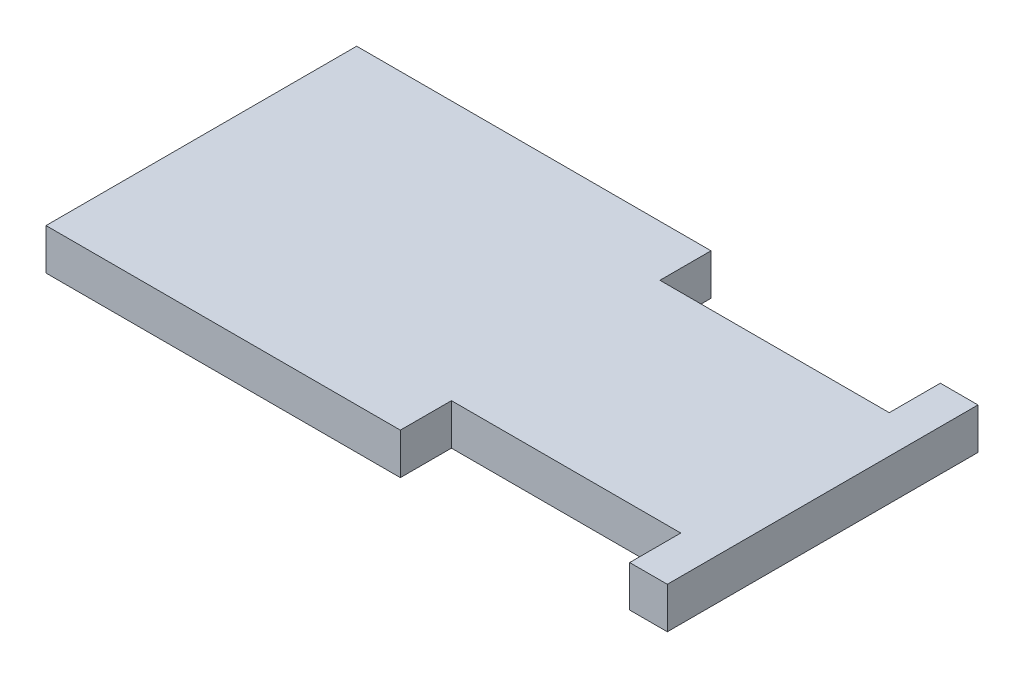
ISO-10303-21;
HEADER;
FILE_DESCRIPTION(('STEP AP214'),'2;1');
FILE_NAME('part.step','',(''),(''),'','','');
FILE_SCHEMA(('AUTOMOTIVE_DESIGN { 1 0 10303 214 1 1 1 1 }'));
ENDSEC;
DATA;
#1=APPLICATION_CONTEXT('core data for automotive mechanical design processes');
#2=APPLICATION_PROTOCOL_DEFINITION('international standard','automotive_design',2000,#1);
#3=PRODUCT_CONTEXT('',#1,'mechanical');
#4=PRODUCT('Part','Part','',(#3));
#5=PRODUCT_RELATED_PRODUCT_CATEGORY('part','',(#4));
#6=PRODUCT_DEFINITION_FORMATION('','',#4);
#7=PRODUCT_DEFINITION_CONTEXT('part definition',#1,'design');
#8=PRODUCT_DEFINITION('design','',#6,#7);
#9=PRODUCT_DEFINITION_SHAPE('','',#8);
#10=(LENGTH_UNIT() NAMED_UNIT(*) SI_UNIT(.MILLI.,.METRE.));
#11=(NAMED_UNIT(*) PLANE_ANGLE_UNIT() SI_UNIT($,.RADIAN.));
#12=(NAMED_UNIT(*) SI_UNIT($,.STERADIAN.) SOLID_ANGLE_UNIT());
#13=UNCERTAINTY_MEASURE_WITH_UNIT(LENGTH_MEASURE(1.E-05),#10,'distance_accuracy_value','');
#14=(GEOMETRIC_REPRESENTATION_CONTEXT(3) GLOBAL_UNCERTAINTY_ASSIGNED_CONTEXT((#13)) GLOBAL_UNIT_ASSIGNED_CONTEXT((#10,
#11,#12)) REPRESENTATION_CONTEXT('',''));
#15=CARTESIAN_POINT('',(0.,0.,0.));
#16=DIRECTION('',(0.,0.,1.));
#17=DIRECTION('',(1.,0.,0.));
#18=AXIS2_PLACEMENT_3D('',#15,#16,#17);
#19=CARTESIAN_POINT('',(-101.6,13.462,-50.8));
#20=DIRECTION('',(0.,0.,1.));
#21=DIRECTION('',(1.,0.,0.));
#22=AXIS2_PLACEMENT_3D('',#19,#20,#21);
#23=PLANE('',#22);
#24=DIRECTION('',(0.,1.,0.));
#25=VECTOR('',#24,1.);
#26=CARTESIAN_POINT('',(14.2854945899929,13.462,-50.8));
#27=LINE('',#26,#25);
#28=CARTESIAN_POINT('',(14.2854945899929,0.,-50.8));
#29=VERTEX_POINT('',#28);
#30=CARTESIAN_POINT('',(14.2854945899929,13.462,-50.8));
#31=VERTEX_POINT('',#30);
#32=EDGE_CURVE('E151',#29,#31,#27,.T.);
#33=ORIENTED_EDGE('',*,*,#32,.F.);
#34=DIRECTION('',(-1.,0.,0.));
#35=VECTOR('',#34,1.);
#36=CARTESIAN_POINT('',(-101.6,0.,-50.8));
#37=LINE('',#36,#35);
#38=CARTESIAN_POINT('',(-101.6,0.,-50.8));
#39=VERTEX_POINT('',#38);
#40=EDGE_CURVE('E211',#29,#39,#37,.T.);
#41=ORIENTED_EDGE('',*,*,#40,.T.);
#42=DIRECTION('',(0.,-1.,0.));
#43=VECTOR('',#42,1.);
#44=CARTESIAN_POINT('',(-101.6,13.462,-50.8));
#45=LINE('',#44,#43);
#46=CARTESIAN_POINT('',(-101.6,13.462,-50.8));
#47=VERTEX_POINT('',#46);
#48=EDGE_CURVE('E230',#47,#39,#45,.T.);
#49=ORIENTED_EDGE('',*,*,#48,.F.);
#50=DIRECTION('',(-1.,0.,0.));
#51=VECTOR('',#50,1.);
#52=CARTESIAN_POINT('',(-101.6,13.462,-50.8));
#53=LINE('',#52,#51);
#54=EDGE_CURVE('E195',#31,#47,#53,.T.);
#55=ORIENTED_EDGE('',*,*,#54,.F.);
#56=EDGE_LOOP('',(#33,#41,#49,#55));
#57=FACE_BOUND('',#56,.T.);
#58=ADVANCED_FACE('F47',(#57),#23,.F.);
#59=DIRECTION('',(0.,-1.,0.));
#60=VECTOR('',#59,1.);
#61=CARTESIAN_POINT('',(89.2854945899928,13.462,-50.8));
#62=LINE('',#61,#60);
#63=CARTESIAN_POINT('',(89.2854945899928,13.462,-50.8));
#64=VERTEX_POINT('',#63);
#65=CARTESIAN_POINT('',(89.2854945899928,0.,-50.8));
#66=VERTEX_POINT('',#65);
#67=EDGE_CURVE('E73',#64,#66,#62,.T.);
#68=ORIENTED_EDGE('',*,*,#67,.F.);
#69=CARTESIAN_POINT('',(101.6,13.462,-50.8));
#70=VERTEX_POINT('',#69);
#71=EDGE_CURVE('E163',#70,#64,#53,.T.);
#72=ORIENTED_EDGE('',*,*,#71,.F.);
#73=DIRECTION('',(0.,-1.,0.));
#74=VECTOR('',#73,1.);
#75=CARTESIAN_POINT('',(101.6,13.462,-50.8));
#76=LINE('',#75,#74);
#77=CARTESIAN_POINT('',(101.6,0.,-50.8));
#78=VERTEX_POINT('',#77);
#79=EDGE_CURVE('E234',#70,#78,#76,.T.);
#80=ORIENTED_EDGE('',*,*,#79,.T.);
#81=EDGE_CURVE('E212',#78,#66,#37,.T.);
#82=ORIENTED_EDGE('',*,*,#81,.T.);
#83=EDGE_LOOP('',(#68,#72,#80,#82));
#84=FACE_BOUND('',#83,.T.);
#85=ADVANCED_FACE('F290',(#84),#23,.F.);
#86=CARTESIAN_POINT('',(-101.6,13.462,50.8));
#87=DIRECTION('',(0.,0.,-1.));
#88=DIRECTION('',(-1.,0.,0.));
#89=AXIS2_PLACEMENT_3D('',#86,#87,#88);
#90=PLANE('',#89);
#91=DIRECTION('',(0.,-1.,0.));
#92=VECTOR('',#91,1.);
#93=CARTESIAN_POINT('',(14.2854945899929,13.462,50.8));
#94=LINE('',#93,#92);
#95=CARTESIAN_POINT('',(14.2854945899929,13.462,50.8));
#96=VERTEX_POINT('',#95);
#97=CARTESIAN_POINT('',(14.2854945899929,0.,50.8));
#98=VERTEX_POINT('',#97);
#99=EDGE_CURVE('E185',#96,#98,#94,.T.);
#100=ORIENTED_EDGE('',*,*,#99,.F.);
#101=DIRECTION('',(1.,0.,0.));
#102=VECTOR('',#101,1.);
#103=CARTESIAN_POINT('',(-101.6,13.462,50.8));
#104=LINE('',#103,#102);
#105=CARTESIAN_POINT('',(-101.6,13.462,50.8));
#106=VERTEX_POINT('',#105);
#107=EDGE_CURVE('E203',#106,#96,#104,.T.);
#108=ORIENTED_EDGE('',*,*,#107,.F.);
#109=DIRECTION('',(0.,-1.,0.));
#110=VECTOR('',#109,1.);
#111=CARTESIAN_POINT('',(-101.6,13.462,50.8));
#112=LINE('',#111,#110);
#113=CARTESIAN_POINT('',(-101.6,0.,50.8));
#114=VERTEX_POINT('',#113);
#115=EDGE_CURVE('E226',#106,#114,#112,.T.);
#116=ORIENTED_EDGE('',*,*,#115,.T.);
#117=DIRECTION('',(1.,0.,0.));
#118=VECTOR('',#117,1.);
#119=CARTESIAN_POINT('',(-101.6,0.,50.8));
#120=LINE('',#119,#118);
#121=EDGE_CURVE('E196',#114,#98,#120,.T.);
#122=ORIENTED_EDGE('',*,*,#121,.T.);
#123=EDGE_LOOP('',(#100,#108,#116,#122));
#124=FACE_BOUND('',#123,.T.);
#125=ADVANCED_FACE('F263',(#124),#90,.F.);
#126=DIRECTION('',(0.,1.,0.));
#127=VECTOR('',#126,1.);
#128=CARTESIAN_POINT('',(89.2854945899928,13.462,50.8));
#129=LINE('',#128,#127);
#130=CARTESIAN_POINT('',(89.2854945899929,0.,50.8));
#131=VERTEX_POINT('',#130);
#132=CARTESIAN_POINT('',(89.2854945899928,13.462,50.8));
#133=VERTEX_POINT('',#132);
#134=EDGE_CURVE('E179',#131,#133,#129,.T.);
#135=ORIENTED_EDGE('',*,*,#134,.F.);
#136=CARTESIAN_POINT('',(101.6,0.,50.8));
#137=VERTEX_POINT('',#136);
#138=EDGE_CURVE('E219',#131,#137,#120,.T.);
#139=ORIENTED_EDGE('',*,*,#138,.T.);
#140=DIRECTION('',(0.,-1.,0.));
#141=VECTOR('',#140,1.);
#142=CARTESIAN_POINT('',(101.6,13.462,50.8));
#143=LINE('',#142,#141);
#144=CARTESIAN_POINT('',(101.6,13.462,50.8));
#145=VERTEX_POINT('',#144);
#146=EDGE_CURVE('E207',#145,#137,#143,.T.);
#147=ORIENTED_EDGE('',*,*,#146,.F.);
#148=EDGE_CURVE('E202',#133,#145,#104,.T.);
#149=ORIENTED_EDGE('',*,*,#148,.F.);
#150=EDGE_LOOP('',(#135,#139,#147,#149));
#151=FACE_BOUND('',#150,.T.);
#152=ADVANCED_FACE('F285',(#151),#90,.F.);
#153=CARTESIAN_POINT('',(0.,13.462,0.));
#154=DIRECTION('',(0.,-1.,0.));
#155=DIRECTION('',(0.,0.,-1.));
#156=AXIS2_PLACEMENT_3D('',#153,#154,#155);
#157=PLANE('',#156);
#158=DIRECTION('',(0.,0.,1.));
#159=VECTOR('',#158,1.);
#160=CARTESIAN_POINT('',(14.2854945899929,13.462,0.));
#161=LINE('',#160,#159);
#162=CARTESIAN_POINT('',(14.2854945899929,13.462,34.0903848170284));
#163=VERTEX_POINT('',#162);
#164=EDGE_CURVE('E188',#163,#96,#161,.T.);
#165=ORIENTED_EDGE('',*,*,#164,.F.);
#166=DIRECTION('',(-1.,0.,0.));
#167=VECTOR('',#166,1.);
#168=CARTESIAN_POINT('',(0.,13.462,34.0903848170284));
#169=LINE('',#168,#167);
#170=CARTESIAN_POINT('',(89.2854945899929,13.462,34.0903848170284));
#171=VERTEX_POINT('',#170);
#172=EDGE_CURVE('E176',#171,#163,#169,.T.);
#173=ORIENTED_EDGE('',*,*,#172,.F.);
#174=DIRECTION('',(0.,0.,-1.));
#175=VECTOR('',#174,1.);
#176=CARTESIAN_POINT('',(89.2854945899928,13.462,0.));
#177=LINE('',#176,#175);
#178=EDGE_CURVE('E182',#133,#171,#177,.T.);
#179=ORIENTED_EDGE('',*,*,#178,.F.);
#180=ORIENTED_EDGE('',*,*,#148,.T.);
#181=DIRECTION('',(0.,0.,-1.));
#182=VECTOR('',#181,1.);
#183=CARTESIAN_POINT('',(101.6,13.462,50.8));
#184=LINE('',#183,#182);
#185=EDGE_CURVE('E192',#145,#70,#184,.T.);
#186=ORIENTED_EDGE('',*,*,#185,.T.);
#187=ORIENTED_EDGE('',*,*,#71,.T.);
#188=DIRECTION('',(0.,0.,-1.));
#189=VECTOR('',#188,1.);
#190=CARTESIAN_POINT('',(89.2854945899928,13.462,0.));
#191=LINE('',#190,#189);
#192=CARTESIAN_POINT('',(89.2854945899928,13.462,-34.0903848170284));
#193=VERTEX_POINT('',#192);
#194=EDGE_CURVE('E152',#193,#64,#191,.T.);
#195=ORIENTED_EDGE('',*,*,#194,.F.);
#196=DIRECTION('',(1.,0.,0.));
#197=VECTOR('',#196,1.);
#198=CARTESIAN_POINT('',(0.,13.462,-34.0903848170284));
#199=LINE('',#198,#197);
#200=CARTESIAN_POINT('',(14.2854945899929,13.462,-34.0903848170284));
#201=VERTEX_POINT('',#200);
#202=EDGE_CURVE('E140',#201,#193,#199,.T.);
#203=ORIENTED_EDGE('',*,*,#202,.F.);
#204=DIRECTION('',(0.,0.,1.));
#205=VECTOR('',#204,1.);
#206=CARTESIAN_POINT('',(14.2854945899929,13.462,0.));
#207=LINE('',#206,#205);
#208=EDGE_CURVE('E173',#31,#201,#207,.T.);
#209=ORIENTED_EDGE('',*,*,#208,.F.);
#210=ORIENTED_EDGE('',*,*,#54,.T.);
#211=DIRECTION('',(0.,0.,1.));
#212=VECTOR('',#211,1.);
#213=CARTESIAN_POINT('',(-101.6,13.462,50.8));
#214=LINE('',#213,#212);
#215=EDGE_CURVE('E199',#47,#106,#214,.T.);
#216=ORIENTED_EDGE('',*,*,#215,.T.);
#217=ORIENTED_EDGE('',*,*,#107,.T.);
#218=EDGE_LOOP('',(#165,#173,#179,#180,#186,#187,#195,#203,#209,#210,#216,#217));
#219=FACE_BOUND('',#218,.T.);
#220=ADVANCED_FACE('F161',(#219),#157,.F.);
#221=CARTESIAN_POINT('',(0.,0.,0.));
#222=DIRECTION('',(0.,-1.,0.));
#223=DIRECTION('',(0.,0.,-1.));
#224=AXIS2_PLACEMENT_3D('',#221,#222,#223);
#225=PLANE('',#224);
#226=CARTESIAN_POINT('',(-81.6514053526068,0.,0.));
#227=DIRECTION('',(0.,-1.,0.));
#228=DIRECTION('',(0.,0.,-1.));
#229=AXIS2_PLACEMENT_3D('',#226,#227,#228);
#230=CIRCLE('',#229,16.1793819767338);
#231=CARTESIAN_POINT('',(-81.6514053526068,0.,16.1793819767338));
#232=VERTEX_POINT('',#231);
#233=EDGE_CURVE('E300',#232,#232,#230,.T.);
#234=ORIENTED_EDGE('',*,*,#233,.F.);
#235=EDGE_LOOP('',(#234));
#236=FACE_BOUND('',#235,.T.);
#237=DIRECTION('',(-1.,0.,0.));
#238=VECTOR('',#237,1.);
#239=CARTESIAN_POINT('',(0.,0.,34.0903848170284));
#240=LINE('',#239,#238);
#241=CARTESIAN_POINT('',(89.2854945899929,0.,34.0903848170284));
#242=VERTEX_POINT('',#241);
#243=CARTESIAN_POINT('',(14.2854945899929,0.,34.0903848170284));
#244=VERTEX_POINT('',#243);
#245=EDGE_CURVE('E247',#242,#244,#240,.T.);
#246=ORIENTED_EDGE('',*,*,#245,.T.);
#247=DIRECTION('',(0.,0.,1.));
#248=VECTOR('',#247,1.);
#249=CARTESIAN_POINT('',(14.2854945899929,0.,0.));
#250=LINE('',#249,#248);
#251=EDGE_CURVE('E57',#244,#98,#250,.T.);
#252=ORIENTED_EDGE('',*,*,#251,.T.);
#253=ORIENTED_EDGE('',*,*,#121,.F.);
#254=DIRECTION('',(0.,0.,1.));
#255=VECTOR('',#254,1.);
#256=CARTESIAN_POINT('',(-101.6,0.,50.8));
#257=LINE('',#256,#255);
#258=EDGE_CURVE('E216',#39,#114,#257,.T.);
#259=ORIENTED_EDGE('',*,*,#258,.F.);
#260=ORIENTED_EDGE('',*,*,#40,.F.);
#261=DIRECTION('',(0.,0.,1.));
#262=VECTOR('',#261,1.);
#263=CARTESIAN_POINT('',(14.2854945899929,0.,0.));
#264=LINE('',#263,#262);
#265=CARTESIAN_POINT('',(14.2854945899929,0.,-34.0903848170284));
#266=VERTEX_POINT('',#265);
#267=EDGE_CURVE('E243',#29,#266,#264,.T.);
#268=ORIENTED_EDGE('',*,*,#267,.T.);
#269=DIRECTION('',(1.,0.,0.));
#270=VECTOR('',#269,1.);
#271=CARTESIAN_POINT('',(0.,0.,-34.0903848170284));
#272=LINE('',#271,#270);
#273=CARTESIAN_POINT('',(89.2854945899928,0.,-34.0903848170284));
#274=VERTEX_POINT('',#273);
#275=EDGE_CURVE('E240',#266,#274,#272,.T.);
#276=ORIENTED_EDGE('',*,*,#275,.T.);
#277=DIRECTION('',(0.,0.,-1.));
#278=VECTOR('',#277,1.);
#279=CARTESIAN_POINT('',(89.2854945899928,0.,0.));
#280=LINE('',#279,#278);
#281=EDGE_CURVE('E155',#274,#66,#280,.T.);
#282=ORIENTED_EDGE('',*,*,#281,.T.);
#283=ORIENTED_EDGE('',*,*,#81,.F.);
#284=DIRECTION('',(0.,0.,-1.));
#285=VECTOR('',#284,1.);
#286=CARTESIAN_POINT('',(101.6,0.,50.8));
#287=LINE('',#286,#285);
#288=EDGE_CURVE('E191',#137,#78,#287,.T.);
#289=ORIENTED_EDGE('',*,*,#288,.F.);
#290=ORIENTED_EDGE('',*,*,#138,.F.);
#291=DIRECTION('',(0.,0.,-1.));
#292=VECTOR('',#291,1.);
#293=CARTESIAN_POINT('',(89.2854945899928,0.,0.));
#294=LINE('',#293,#292);
#295=EDGE_CURVE('E251',#131,#242,#294,.T.);
#296=ORIENTED_EDGE('',*,*,#295,.T.);
#297=EDGE_LOOP('',(#246,#252,#253,#259,#260,#268,#276,#282,#283,#289,#290,#296));
#298=FACE_BOUND('',#297,.T.);
#299=ADVANCED_FACE('F258',(#236,#298),#225,.T.);
#300=CARTESIAN_POINT('',(101.6,13.462,50.8));
#301=DIRECTION('',(-1.,0.,0.));
#302=DIRECTION('',(0.,0.,1.));
#303=AXIS2_PLACEMENT_3D('',#300,#301,#302);
#304=PLANE('',#303);
#305=ORIENTED_EDGE('',*,*,#288,.T.);
#306=ORIENTED_EDGE('',*,*,#79,.F.);
#307=ORIENTED_EDGE('',*,*,#185,.F.);
#308=ORIENTED_EDGE('',*,*,#146,.T.);
#309=EDGE_LOOP('',(#305,#306,#307,#308));
#310=FACE_BOUND('',#309,.T.);
#311=ADVANCED_FACE('F49',(#310),#304,.F.);
#312=CARTESIAN_POINT('',(-101.6,13.462,50.8));
#313=DIRECTION('',(1.,0.,0.));
#314=DIRECTION('',(0.,0.,-1.));
#315=AXIS2_PLACEMENT_3D('',#312,#313,#314);
#316=PLANE('',#315);
#317=ORIENTED_EDGE('',*,*,#258,.T.);
#318=ORIENTED_EDGE('',*,*,#115,.F.);
#319=ORIENTED_EDGE('',*,*,#215,.F.);
#320=ORIENTED_EDGE('',*,*,#48,.T.);
#321=EDGE_LOOP('',(#317,#318,#319,#320));
#322=FACE_BOUND('',#321,.T.);
#323=ADVANCED_FACE('F268',(#322),#316,.F.);
#324=CARTESIAN_POINT('',(14.2854945899929,26.67,-34.0903848170284));
#325=DIRECTION('',(1.,0.,0.));
#326=DIRECTION('',(0.,0.,-1.));
#327=AXIS2_PLACEMENT_3D('',#324,#325,#326);
#328=PLANE('',#327);
#329=ORIENTED_EDGE('',*,*,#208,.T.);
#330=DIRECTION('',(0.,-1.,0.));
#331=VECTOR('',#330,1.);
#332=CARTESIAN_POINT('',(14.2854945899929,26.67,-34.0903848170284));
#333=LINE('',#332,#331);
#334=EDGE_CURVE('E146',#201,#266,#333,.T.);
#335=ORIENTED_EDGE('',*,*,#334,.T.);
#336=ORIENTED_EDGE('',*,*,#267,.F.);
#337=ORIENTED_EDGE('',*,*,#32,.T.);
#338=EDGE_LOOP('',(#329,#335,#336,#337));
#339=FACE_BOUND('',#338,.T.);
#340=ADVANCED_FACE('F292',(#339),#328,.T.);
#341=CARTESIAN_POINT('',(14.2854945899929,26.67,-34.0903848170284));
#342=DIRECTION('',(0.,0.,-1.));
#343=DIRECTION('',(-1.,0.,0.));
#344=AXIS2_PLACEMENT_3D('',#341,#342,#343);
#345=PLANE('',#344);
#346=ORIENTED_EDGE('',*,*,#202,.T.);
#347=DIRECTION('',(0.,-1.,0.));
#348=VECTOR('',#347,1.);
#349=CARTESIAN_POINT('',(89.2854945899928,26.67,-34.0903848170284));
#350=LINE('',#349,#348);
#351=EDGE_CURVE('E143',#193,#274,#350,.T.);
#352=ORIENTED_EDGE('',*,*,#351,.T.);
#353=ORIENTED_EDGE('',*,*,#275,.F.);
#354=ORIENTED_EDGE('',*,*,#334,.F.);
#355=EDGE_LOOP('',(#346,#352,#353,#354));
#356=FACE_BOUND('',#355,.T.);
#357=ADVANCED_FACE('F142',(#356),#345,.T.);
#358=CARTESIAN_POINT('',(89.2854945899928,26.67,-34.0903848170284));
#359=DIRECTION('',(-1.,0.,0.));
#360=DIRECTION('',(0.,0.,1.));
#361=AXIS2_PLACEMENT_3D('',#358,#359,#360);
#362=PLANE('',#361);
#363=ORIENTED_EDGE('',*,*,#194,.T.);
#364=ORIENTED_EDGE('',*,*,#67,.T.);
#365=ORIENTED_EDGE('',*,*,#281,.F.);
#366=ORIENTED_EDGE('',*,*,#351,.F.);
#367=EDGE_LOOP('',(#363,#364,#365,#366));
#368=FACE_BOUND('',#367,.T.);
#369=ADVANCED_FACE('F154',(#368),#362,.T.);
#370=CARTESIAN_POINT('',(14.2854945899929,26.67,34.0903848170284));
#371=DIRECTION('',(1.,0.,0.));
#372=DIRECTION('',(0.,0.,-1.));
#373=AXIS2_PLACEMENT_3D('',#370,#371,#372);
#374=PLANE('',#373);
#375=ORIENTED_EDGE('',*,*,#164,.T.);
#376=ORIENTED_EDGE('',*,*,#99,.T.);
#377=ORIENTED_EDGE('',*,*,#251,.F.);
#378=DIRECTION('',(0.,-1.,0.));
#379=VECTOR('',#378,1.);
#380=CARTESIAN_POINT('',(14.2854945899929,26.67,34.0903848170284));
#381=LINE('',#380,#379);
#382=EDGE_CURVE('E65',#163,#244,#381,.T.);
#383=ORIENTED_EDGE('',*,*,#382,.F.);
#384=EDGE_LOOP('',(#375,#376,#377,#383));
#385=FACE_BOUND('',#384,.T.);
#386=ADVANCED_FACE('F346',(#385),#374,.T.);
#387=CARTESIAN_POINT('',(89.2854945899929,26.67,34.0903848170284));
#388=DIRECTION('',(-1.,0.,0.));
#389=DIRECTION('',(0.,0.,1.));
#390=AXIS2_PLACEMENT_3D('',#387,#388,#389);
#391=PLANE('',#390);
#392=ORIENTED_EDGE('',*,*,#178,.T.);
#393=DIRECTION('',(0.,-1.,0.));
#394=VECTOR('',#393,1.);
#395=CARTESIAN_POINT('',(89.2854945899929,26.67,34.0903848170284));
#396=LINE('',#395,#394);
#397=EDGE_CURVE('E167',#171,#242,#396,.T.);
#398=ORIENTED_EDGE('',*,*,#397,.T.);
#399=ORIENTED_EDGE('',*,*,#295,.F.);
#400=ORIENTED_EDGE('',*,*,#134,.T.);
#401=EDGE_LOOP('',(#392,#398,#399,#400));
#402=FACE_BOUND('',#401,.T.);
#403=ADVANCED_FACE('F349',(#402),#391,.T.);
#404=CARTESIAN_POINT('',(14.2854945899929,26.67,34.0903848170284));
#405=DIRECTION('',(0.,0.,1.));
#406=DIRECTION('',(1.,0.,0.));
#407=AXIS2_PLACEMENT_3D('',#404,#405,#406);
#408=PLANE('',#407);
#409=ORIENTED_EDGE('',*,*,#172,.T.);
#410=ORIENTED_EDGE('',*,*,#382,.T.);
#411=ORIENTED_EDGE('',*,*,#245,.F.);
#412=ORIENTED_EDGE('',*,*,#397,.F.);
#413=EDGE_LOOP('',(#409,#410,#411,#412));
#414=FACE_BOUND('',#413,.T.);
#415=ADVANCED_FACE('F352',(#414),#408,.T.);
#416=CARTESIAN_POINT('',(-81.6514053526068,-1.52400000000001,0.));
#417=DIRECTION('',(0.,1.,0.));
#418=DIRECTION('',(0.,0.,1.));
#419=AXIS2_PLACEMENT_3D('',#416,#417,#418);
#420=CYLINDRICAL_SURFACE('',#419,16.1793819767338);
#421=CARTESIAN_POINT('',(-81.6514053526068,-1.52400000000001,0.));
#422=DIRECTION('',(0.,-1.,0.));
#423=DIRECTION('',(0.,0.,-1.));
#424=AXIS2_PLACEMENT_3D('',#421,#422,#423);
#425=CIRCLE('',#424,16.1793819767338);
#426=CARTESIAN_POINT('',(-81.6514053526068,-1.52400000000001,16.1793819767338));
#427=VERTEX_POINT('',#426);
#428=EDGE_CURVE('E157',#427,#427,#425,.T.);
#429=CARTESIAN_POINT('',(-81.6514053526068,-1.52400000000001,16.1793819767338));
#430=CARTESIAN_POINT('',(-81.6514053526068,-1.50812500000001,16.1793819767338));
#431=CARTESIAN_POINT('',(-81.6514053526068,-1.49225000000001,16.1793819767338));
#432=CARTESIAN_POINT('',(-81.6514053526068,-1.46050000000001,16.1793819767338));
#433=CARTESIAN_POINT('',(-81.6514053526068,-1.44462500000001,16.1793819767338));
#434=CARTESIAN_POINT('',(-81.6514053526068,-1.41287500000001,16.1793819767338));
#435=CARTESIAN_POINT('',(-81.6514053526068,-1.39700000000001,16.1793819767338));
#436=CARTESIAN_POINT('',(-81.6514053526068,-1.36525000000001,16.1793819767338));
#437=CARTESIAN_POINT('',(-81.6514053526068,-1.34937500000001,16.1793819767338));
#438=CARTESIAN_POINT('',(-81.6514053526068,-1.31762500000001,16.1793819767338));
#439=CARTESIAN_POINT('',(-81.6514053526068,-1.30175000000001,16.1793819767338));
#440=CARTESIAN_POINT('',(-81.6514053526068,-1.27000000000001,16.1793819767338));
#441=CARTESIAN_POINT('',(-81.6514053526068,-1.25412500000001,16.1793819767338));
#442=CARTESIAN_POINT('',(-81.6514053526068,-1.22237500000001,16.1793819767338));
#443=CARTESIAN_POINT('',(-81.6514053526068,-1.20650000000001,16.1793819767338));
#444=CARTESIAN_POINT('',(-81.6514053526068,-1.17475000000001,16.1793819767338));
#445=CARTESIAN_POINT('',(-81.6514053526068,-1.15887500000001,16.1793819767338));
#446=CARTESIAN_POINT('',(-81.6514053526068,-1.12712500000001,16.1793819767338));
#447=CARTESIAN_POINT('',(-81.6514053526068,-1.11125000000001,16.1793819767338));
#448=CARTESIAN_POINT('',(-81.6514053526068,-1.07950000000001,16.1793819767338));
#449=CARTESIAN_POINT('',(-81.6514053526068,-1.06362500000001,16.1793819767338));
#450=CARTESIAN_POINT('',(-81.6514053526068,-1.03187500000001,16.1793819767338));
#451=CARTESIAN_POINT('',(-81.6514053526068,-1.01600000000001,16.1793819767338));
#452=CARTESIAN_POINT('',(-81.6514053526068,-0.984250000000005,16.1793819767338));
#453=CARTESIAN_POINT('',(-81.6514053526068,-0.968375000000005,16.1793819767338));
#454=CARTESIAN_POINT('',(-81.6514053526068,-0.936625000000005,16.1793819767338));
#455=CARTESIAN_POINT('',(-81.6514053526068,-0.920750000000005,16.1793819767338));
#456=CARTESIAN_POINT('',(-81.6514053526068,-0.889000000000005,16.1793819767338));
#457=CARTESIAN_POINT('',(-81.6514053526068,-0.873125000000005,16.1793819767338));
#458=CARTESIAN_POINT('',(-81.6514053526068,-0.841375000000004,16.1793819767338));
#459=CARTESIAN_POINT('',(-81.6514053526068,-0.825500000000004,16.1793819767338));
#460=CARTESIAN_POINT('',(-81.6514053526068,-0.793750000000004,16.1793819767338));
#461=CARTESIAN_POINT('',(-81.6514053526068,-0.777875000000004,16.1793819767338));
#462=CARTESIAN_POINT('',(-81.6514053526068,-0.746125000000004,16.1793819767338));
#463=CARTESIAN_POINT('',(-81.6514053526068,-0.730250000000004,16.1793819767338));
#464=CARTESIAN_POINT('',(-81.6514053526068,-0.698500000000004,16.1793819767338));
#465=CARTESIAN_POINT('',(-81.6514053526068,-0.682625000000004,16.1793819767338));
#466=CARTESIAN_POINT('',(-81.6514053526068,-0.650875000000003,16.1793819767338));
#467=CARTESIAN_POINT('',(-81.6514053526068,-0.635000000000003,16.1793819767338));
#468=CARTESIAN_POINT('',(-81.6514053526068,-0.603250000000003,16.1793819767338));
#469=CARTESIAN_POINT('',(-81.6514053526068,-0.587375000000003,16.1793819767338));
#470=CARTESIAN_POINT('',(-81.6514053526068,-0.555625000000003,16.1793819767338));
#471=CARTESIAN_POINT('',(-81.6514053526068,-0.539750000000003,16.1793819767338));
#472=CARTESIAN_POINT('',(-81.6514053526068,-0.508000000000003,16.1793819767338));
#473=CARTESIAN_POINT('',(-81.6514053526068,-0.492125000000003,16.1793819767338));
#474=CARTESIAN_POINT('',(-81.6514053526068,-0.460375000000002,16.1793819767338));
#475=CARTESIAN_POINT('',(-81.6514053526068,-0.444500000000002,16.1793819767338));
#476=CARTESIAN_POINT('',(-81.6514053526068,-0.412750000000002,16.1793819767338));
#477=CARTESIAN_POINT('',(-81.6514053526068,-0.396875000000002,16.1793819767338));
#478=CARTESIAN_POINT('',(-81.6514053526068,-0.365125000000002,16.1793819767338));
#479=CARTESIAN_POINT('',(-81.6514053526068,-0.349250000000002,16.1793819767338));
#480=CARTESIAN_POINT('',(-81.6514053526068,-0.317500000000002,16.1793819767338));
#481=CARTESIAN_POINT('',(-81.6514053526068,-0.301625000000002,16.1793819767338));
#482=CARTESIAN_POINT('',(-81.6514053526068,-0.269875000000001,16.1793819767338));
#483=CARTESIAN_POINT('',(-81.6514053526068,-0.254000000000001,16.1793819767338));
#484=CARTESIAN_POINT('',(-81.6514053526068,-0.222250000000001,16.1793819767338));
#485=CARTESIAN_POINT('',(-81.6514053526068,-0.206375000000001,16.1793819767338));
#486=CARTESIAN_POINT('',(-81.6514053526068,-0.174625000000001,16.1793819767338));
#487=CARTESIAN_POINT('',(-81.6514053526068,-0.158750000000001,16.1793819767338));
#488=CARTESIAN_POINT('',(-81.6514053526068,-0.127000000000001,16.1793819767338));
#489=CARTESIAN_POINT('',(-81.6514053526068,-0.111125,16.1793819767338));
#490=CARTESIAN_POINT('',(-81.6514053526068,-0.0793750000000002,16.1793819767338));
#491=CARTESIAN_POINT('',(-81.6514053526068,-0.0635000000000002,16.1793819767338));
#492=CARTESIAN_POINT('',(-81.6514053526068,-0.03175,16.1793819767338));
#493=CARTESIAN_POINT('',(-81.6514053526068,-0.0158749999999999,16.1793819767338));
#494=CARTESIAN_POINT('',(-81.6514053526068,0.,16.1793819767338));
#495=B_SPLINE_CURVE_WITH_KNOTS('',3,(#429,#430,#431,#432,#433,#434,#435,#436,#437,#438,#439,
#440,#441,#442,#443,#444,#445,#446,#447,#448,#449,#450,#451,#452,#453,#454,#455,#456,#457,#458,
#459,#460,#461,#462,#463,#464,#465,#466,#467,#468,#469,#470,#471,#472,#473,#474,#475,#476,#477,
#478,#479,#480,#481,#482,#483,#484,#485,#486,#487,#488,#489,#490,#491,#492,#493,#494),
.UNSPECIFIED.,.F.,.F.,(4,2,2,2,2,2,2,2,2,2,2,2,2,2,2,2,2,2,2,2,2,2,2,2,2,2,2,2,2,2,2,2,4),(0.,
0.0476250000000004,0.0952500000000007,0.142875000000001,0.190500000000001,0.238125000000001,
0.285750000000002,0.333375000000002,0.381000000000002,0.428625000000003,0.476250000000003,
0.523875000000003,0.571500000000003,0.619125000000004,0.666750000000004,0.714375000000004,
0.762000000000004,0.809625000000005,0.857250000000005,0.904875000000005,0.952500000000006,
1.00012500000001,1.04775000000001,1.09537500000001,1.14300000000001,1.19062500000001,
1.23825000000001,1.28587500000001,1.33350000000001,1.38112500000001,1.42875000000001,
1.47637500000001,1.52400000000001),.UNSPECIFIED.);
#496=EDGE_CURVE('BSEAM356',#427,#232,#495,.T.);
#497=ORIENTED_EDGE('',*,*,#428,.F.);
#498=ORIENTED_EDGE('',*,*,#233,.T.);
#499=ORIENTED_EDGE('',*,*,#496,.T.);
#500=ORIENTED_EDGE('',*,*,#496,.F.);
#501=EDGE_LOOP('',(#497,#499,#498,#500));
#502=FACE_BOUND('',#501,.T.);
#503=ADVANCED_FACE('F356',(#502),#420,.T.);
#504=CARTESIAN_POINT('',(0.,-1.52400000000001,0.));
#505=DIRECTION('',(0.,-1.,0.));
#506=DIRECTION('',(0.,0.,-1.));
#507=AXIS2_PLACEMENT_3D('',#504,#505,#506);
#508=PLANE('',#507);
#509=CARTESIAN_POINT('',(-81.6514053526068,-1.52400000000001,0.));
#510=DIRECTION('',(0.,-1.,0.));
#511=DIRECTION('',(0.,0.,-1.));
#512=AXIS2_PLACEMENT_3D('',#509,#510,#511);
#513=CIRCLE('',#512,8.05355351952019);
#514=CARTESIAN_POINT('',(-81.6514053526068,-1.52400000000001,-8.05355351952018));
#515=VERTEX_POINT('',#514);
#516=EDGE_CURVE('E12',#515,#515,#513,.T.);
#517=ORIENTED_EDGE('',*,*,#516,.F.);
#518=EDGE_LOOP('',(#517));
#519=FACE_BOUND('',#518,.T.);
#520=ORIENTED_EDGE('',*,*,#428,.T.);
#521=EDGE_LOOP('',(#520));
#522=FACE_BOUND('',#521,.T.);
#523=ADVANCED_FACE('F359',(#519,#522),#508,.T.);
#524=CARTESIAN_POINT('',(-81.6514053526068,-12.954,0.));
#525=DIRECTION('',(0.,1.,0.));
#526=DIRECTION('',(0.,0.,1.));
#527=AXIS2_PLACEMENT_3D('',#524,#525,#526);
#528=CYLINDRICAL_SURFACE('',#527,8.05355351952019);
#529=CARTESIAN_POINT('',(-81.6514053526068,-12.954,0.));
#530=DIRECTION('',(0.,-1.,0.));
#531=DIRECTION('',(0.,0.,-1.));
#532=AXIS2_PLACEMENT_3D('',#529,#530,#531);
#533=CIRCLE('',#532,8.05355351952019);
#534=CARTESIAN_POINT('',(-81.6514053526068,-12.954,-8.05355351952018));
#535=VERTEX_POINT('',#534);
#536=EDGE_CURVE('E304',#535,#535,#533,.T.);
#537=ORIENTED_EDGE('',*,*,#536,.F.);
#538=EDGE_LOOP('',(#537));
#539=FACE_BOUND('',#538,.T.);
#540=ORIENTED_EDGE('',*,*,#516,.T.);
#541=EDGE_LOOP('',(#540));
#542=FACE_BOUND('',#541,.T.);
#543=ADVANCED_FACE('F324',(#539,#542),#528,.T.);
#544=CARTESIAN_POINT('',(0.,-12.954,0.));
#545=DIRECTION('',(0.,-1.,0.));
#546=DIRECTION('',(0.,0.,-1.));
#547=AXIS2_PLACEMENT_3D('',#544,#545,#546);
#548=PLANE('',#547);
#549=CARTESIAN_POINT('',(-81.6514053526068,-12.954,0.));
#550=DIRECTION('',(0.,-1.,0.));
#551=DIRECTION('',(0.,0.,-1.));
#552=AXIS2_PLACEMENT_3D('',#549,#550,#551);
#553=CIRCLE('',#552,4.83543126440276);
#554=CARTESIAN_POINT('',(-81.6514053526068,-12.954,-4.83543126440276));
#555=VERTEX_POINT('',#554);
#556=EDGE_CURVE('E51',#555,#555,#553,.F.);
#557=ORIENTED_EDGE('',*,*,#556,.T.);
#558=EDGE_LOOP('',(#557));
#559=FACE_BOUND('',#558,.T.);
#560=ORIENTED_EDGE('',*,*,#536,.T.);
#561=EDGE_LOOP('',(#560));
#562=FACE_BOUND('',#561,.T.);
#563=ADVANCED_FACE('F316',(#559,#562),#548,.T.);
#564=CARTESIAN_POINT('',(-81.6514053526068,-12.954,0.));
#565=DIRECTION('',(-1.,0.,0.));
#566=DIRECTION('',(0.,0.,1.));
#567=AXIS2_PLACEMENT_3D('',#564,#565,#566);
#568=SPHERICAL_SURFACE('',#567,4.83543126440276);
#569=CARTESIAN_POINT('',(-81.6514053526068,-12.954,0.));
#570=DIRECTION('',(0.,-1.,0.));
#571=DIRECTION('',(0.,0.,-1.));
#572=AXIS2_PLACEMENT_3D('',#569,#570,#571);
#573=SPHERICAL_SURFACE('',#572,4.83543126440276);
#574=ORIENTED_EDGE('',*,*,#556,.F.);
#575=EDGE_LOOP('',(#574));
#576=FACE_BOUND('',#575,.T.);
#577=ADVANCED_FACE('F318',(#576),#573,.T.);
#578=CLOSED_SHELL('',(#58,#85,#125,#152,#220,#299,#311,#323,#340,#357,#369,#386,#403,#415,#503,
#523,#543,#563,#577));
#579=MANIFOLD_SOLID_BREP('B2',#578);
#580=ADVANCED_BREP_SHAPE_REPRESENTATION('',(#18,#579),#14);
#581=SHAPE_DEFINITION_REPRESENTATION(#9,#580);
ENDSEC;
END-ISO-10303-21;
